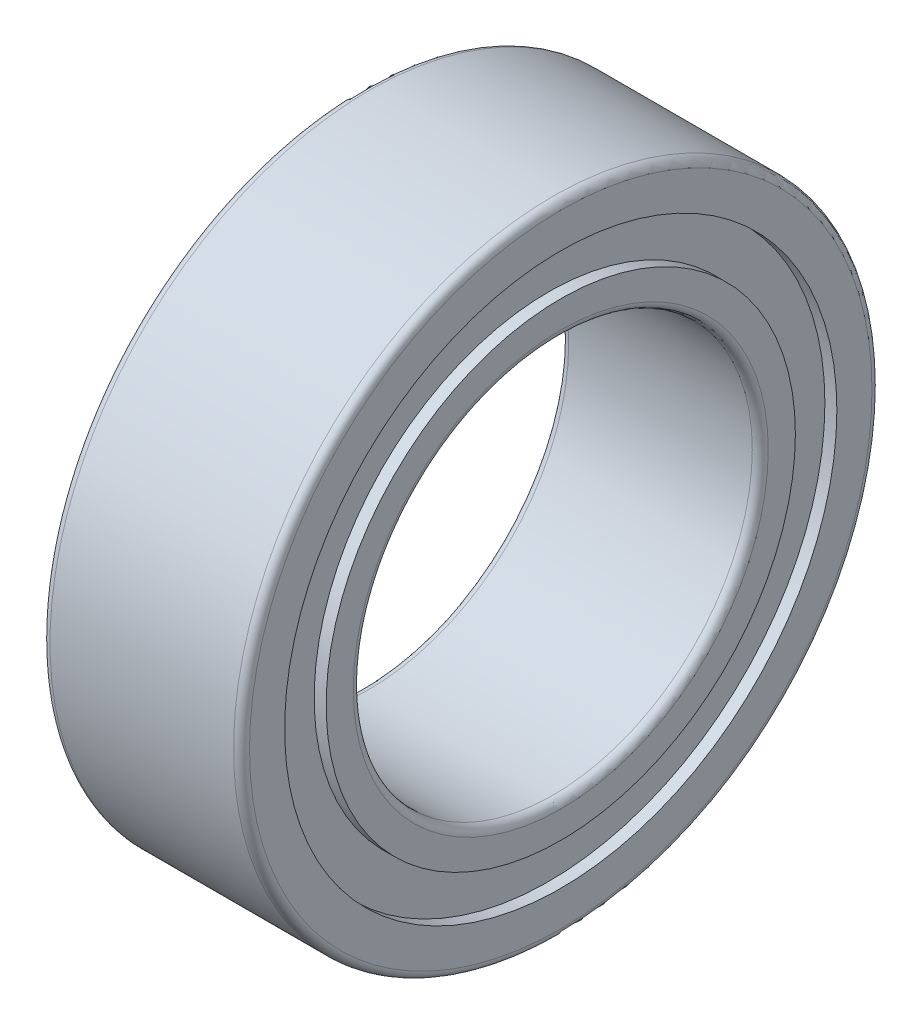
ISO-10303-21;
HEADER;
FILE_DESCRIPTION(('STEP AP214'),'2;1');
FILE_NAME('part.step','',(''),(''),'','','');
FILE_SCHEMA(('AUTOMOTIVE_DESIGN { 1 0 10303 214 1 1 1 1 }'));
ENDSEC;
DATA;
#1=APPLICATION_CONTEXT('core data for automotive mechanical design processes');
#2=APPLICATION_PROTOCOL_DEFINITION('international standard','automotive_design',2000,#1);
#3=PRODUCT_CONTEXT('',#1,'mechanical');
#4=PRODUCT('Part','Part','',(#3));
#5=PRODUCT_RELATED_PRODUCT_CATEGORY('part','',(#4));
#6=PRODUCT_DEFINITION_FORMATION('','',#4);
#7=PRODUCT_DEFINITION_CONTEXT('part definition',#1,'design');
#8=PRODUCT_DEFINITION('design','',#6,#7);
#9=PRODUCT_DEFINITION_SHAPE('','',#8);
#10=(LENGTH_UNIT() NAMED_UNIT(*) SI_UNIT(.MILLI.,.METRE.));
#11=(NAMED_UNIT(*) PLANE_ANGLE_UNIT() SI_UNIT($,.RADIAN.));
#12=(NAMED_UNIT(*) SI_UNIT($,.STERADIAN.) SOLID_ANGLE_UNIT());
#13=UNCERTAINTY_MEASURE_WITH_UNIT(LENGTH_MEASURE(1.E-05),#10,'distance_accuracy_value','');
#14=(GEOMETRIC_REPRESENTATION_CONTEXT(3) GLOBAL_UNCERTAINTY_ASSIGNED_CONTEXT((#13)) GLOBAL_UNIT_ASSIGNED_CONTEXT((#10,
#11,#12)) REPRESENTATION_CONTEXT('',''));
#15=CARTESIAN_POINT('',(0.,0.,0.));
#16=DIRECTION('',(0.,0.,1.));
#17=DIRECTION('',(1.,0.,0.));
#18=AXIS2_PLACEMENT_3D('',#15,#16,#17);
#19=CARTESIAN_POINT('',(-1.15,0.,0.));
#20=DIRECTION('',(1.,0.,0.));
#21=DIRECTION('',(0.,0.,-1.));
#22=AXIS2_PLACEMENT_3D('',#19,#20,#21);
#23=TOROIDAL_SURFACE('',#22,3.9,0.1);
#24=CARTESIAN_POINT('',(-1.25,0.,0.));
#25=DIRECTION('',(1.,0.,0.));
#26=DIRECTION('',(0.,0.,-1.));
#27=AXIS2_PLACEMENT_3D('',#24,#25,#26);
#28=CIRCLE('',#27,3.9);
#29=CARTESIAN_POINT('',(-1.25,0.,-3.9));
#30=VERTEX_POINT('',#29);
#31=EDGE_CURVE('E10',#30,#30,#28,.T.);
#32=ORIENTED_EDGE('',*,*,#31,.T.);
#33=EDGE_LOOP('',(#32));
#34=FACE_BOUND('',#33,.T.);
#35=CARTESIAN_POINT('',(-1.15,0.,0.));
#36=DIRECTION('',(1.,0.,0.));
#37=DIRECTION('',(0.,0.,-1.));
#38=AXIS2_PLACEMENT_3D('',#35,#36,#37);
#39=CIRCLE('',#38,4.);
#40=CARTESIAN_POINT('',(-1.15,0.,-4.));
#41=VERTEX_POINT('',#40);
#42=EDGE_CURVE('E102',#41,#41,#39,.T.);
#43=ORIENTED_EDGE('',*,*,#42,.F.);
#44=EDGE_LOOP('',(#43));
#45=FACE_BOUND('',#44,.T.);
#46=ADVANCED_FACE('F16',(#34,#45),#23,.T.);
#47=CARTESIAN_POINT('',(-1.25,3.46,0.));
#48=DIRECTION('',(1.,0.,0.));
#49=DIRECTION('',(0.,1.,0.));
#50=AXIS2_PLACEMENT_3D('',#47,#48,#49);
#51=PLANE('',#50);
#52=CARTESIAN_POINT('',(-1.25,0.,0.));
#53=DIRECTION('',(1.,0.,0.));
#54=DIRECTION('',(0.,0.,-1.));
#55=AXIS2_PLACEMENT_3D('',#52,#53,#54);
#56=CIRCLE('',#55,3.46);
#57=CARTESIAN_POINT('',(-1.25,0.,-3.46));
#58=VERTEX_POINT('',#57);
#59=EDGE_CURVE('E27',#58,#58,#56,.T.);
#60=ORIENTED_EDGE('',*,*,#59,.T.);
#61=EDGE_LOOP('',(#60));
#62=FACE_BOUND('',#61,.T.);
#63=ORIENTED_EDGE('',*,*,#31,.F.);
#64=EDGE_LOOP('',(#63));
#65=FACE_BOUND('',#64,.T.);
#66=ADVANCED_FACE('F18',(#62,#65),#51,.F.);
#67=CARTESIAN_POINT('',(1.25,0.,0.));
#68=DIRECTION('',(-1.,0.,0.));
#69=DIRECTION('',(0.,0.,-1.));
#70=AXIS2_PLACEMENT_3D('',#67,#68,#69);
#71=CYLINDRICAL_SURFACE('',#70,3.46);
#72=ORIENTED_EDGE('',*,*,#59,.F.);
#73=EDGE_LOOP('',(#72));
#74=FACE_BOUND('',#73,.T.);
#75=CARTESIAN_POINT('',(-1.1,0.,0.));
#76=DIRECTION('',(1.,0.,0.));
#77=DIRECTION('',(0.,0.,-1.));
#78=AXIS2_PLACEMENT_3D('',#75,#76,#77);
#79=CIRCLE('',#78,3.46);
#80=CARTESIAN_POINT('',(-1.1,0.,-3.46));
#81=VERTEX_POINT('',#80);
#82=EDGE_CURVE('E20',#81,#81,#79,.T.);
#83=ORIENTED_EDGE('',*,*,#82,.T.);
#84=EDGE_LOOP('',(#83));
#85=FACE_BOUND('',#84,.T.);
#86=ADVANCED_FACE('F80',(#74,#85),#71,.F.);
#87=CARTESIAN_POINT('',(-1.1,2.94,0.));
#88=DIRECTION('',(1.,0.,0.));
#89=DIRECTION('',(0.,1.,0.));
#90=AXIS2_PLACEMENT_3D('',#87,#88,#89);
#91=PLANE('',#90);
#92=CARTESIAN_POINT('',(-1.1,0.,0.));
#93=DIRECTION('',(1.,0.,0.));
#94=DIRECTION('',(0.,0.,-1.));
#95=AXIS2_PLACEMENT_3D('',#92,#93,#94);
#96=CIRCLE('',#95,2.94);
#97=CARTESIAN_POINT('',(-1.1,0.,-2.94));
#98=VERTEX_POINT('',#97);
#99=EDGE_CURVE('E93',#98,#98,#96,.T.);
#100=ORIENTED_EDGE('',*,*,#99,.T.);
#101=EDGE_LOOP('',(#100));
#102=FACE_BOUND('',#101,.T.);
#103=ORIENTED_EDGE('',*,*,#82,.F.);
#104=EDGE_LOOP('',(#103));
#105=FACE_BOUND('',#104,.T.);
#106=ADVANCED_FACE('F194',(#102,#105),#91,.F.);
#107=CARTESIAN_POINT('',(1.15,0.,0.));
#108=DIRECTION('',(1.,0.,0.));
#109=DIRECTION('',(0.,0.,-1.));
#110=AXIS2_PLACEMENT_3D('',#107,#108,#109);
#111=TOROIDAL_SURFACE('',#110,2.6,0.1);
#112=CARTESIAN_POINT('',(1.25,0.,0.));
#113=DIRECTION('',(1.,0.,0.));
#114=DIRECTION('',(0.,0.,-1.));
#115=AXIS2_PLACEMENT_3D('',#112,#113,#114);
#116=CIRCLE('',#115,2.6);
#117=CARTESIAN_POINT('',(1.25,0.,-2.6));
#118=VERTEX_POINT('',#117);
#119=EDGE_CURVE('E116',#118,#118,#116,.T.);
#120=ORIENTED_EDGE('',*,*,#119,.T.);
#121=EDGE_LOOP('',(#120));
#122=FACE_BOUND('',#121,.T.);
#123=CARTESIAN_POINT('',(1.15,0.,0.));
#124=DIRECTION('',(1.,0.,0.));
#125=DIRECTION('',(0.,0.,-1.));
#126=AXIS2_PLACEMENT_3D('',#123,#124,#125);
#127=CIRCLE('',#126,2.5);
#128=CARTESIAN_POINT('',(1.15,0.,-2.5));
#129=VERTEX_POINT('',#128);
#130=EDGE_CURVE('E74',#129,#129,#127,.T.);
#131=ORIENTED_EDGE('',*,*,#130,.F.);
#132=EDGE_LOOP('',(#131));
#133=FACE_BOUND('',#132,.T.);
#134=ADVANCED_FACE('F197',(#122,#133),#111,.T.);
#135=CARTESIAN_POINT('',(50.,0.,0.));
#136=DIRECTION('',(-1.,0.,0.));
#137=DIRECTION('',(0.,0.,-1.));
#138=AXIS2_PLACEMENT_3D('',#135,#136,#137);
#139=CYLINDRICAL_SURFACE('',#138,2.5);
#140=ORIENTED_EDGE('',*,*,#130,.T.);
#141=EDGE_LOOP('',(#140));
#142=FACE_BOUND('',#141,.T.);
#143=CARTESIAN_POINT('',(-1.15,0.,0.));
#144=DIRECTION('',(1.,0.,0.));
#145=DIRECTION('',(0.,0.,-1.));
#146=AXIS2_PLACEMENT_3D('',#143,#144,#145);
#147=CIRCLE('',#146,2.5);
#148=CARTESIAN_POINT('',(-1.15,0.,-2.5));
#149=VERTEX_POINT('',#148);
#150=EDGE_CURVE('E89',#149,#149,#147,.T.);
#151=ORIENTED_EDGE('',*,*,#150,.F.);
#152=EDGE_LOOP('',(#151));
#153=FACE_BOUND('',#152,.T.);
#154=ADVANCED_FACE('F200',(#142,#153),#139,.F.);
#155=CARTESIAN_POINT('',(-1.15,0.,0.));
#156=DIRECTION('',(1.,0.,0.));
#157=DIRECTION('',(0.,0.,-1.));
#158=AXIS2_PLACEMENT_3D('',#155,#156,#157);
#159=TOROIDAL_SURFACE('',#158,2.6,0.1);
#160=ORIENTED_EDGE('',*,*,#150,.T.);
#161=EDGE_LOOP('',(#160));
#162=FACE_BOUND('',#161,.T.);
#163=CARTESIAN_POINT('',(-1.25,0.,0.));
#164=DIRECTION('',(1.,0.,0.));
#165=DIRECTION('',(0.,0.,-1.));
#166=AXIS2_PLACEMENT_3D('',#163,#164,#165);
#167=CIRCLE('',#166,2.6);
#168=CARTESIAN_POINT('',(-1.25,0.,-2.6));
#169=VERTEX_POINT('',#168);
#170=EDGE_CURVE('E95',#169,#169,#167,.T.);
#171=ORIENTED_EDGE('',*,*,#170,.F.);
#172=EDGE_LOOP('',(#171));
#173=FACE_BOUND('',#172,.T.);
#174=ADVANCED_FACE('F230',(#162,#173),#159,.T.);
#175=CARTESIAN_POINT('',(1.25,0.,0.));
#176=DIRECTION('',(-1.,0.,0.));
#177=DIRECTION('',(0.,0.,-1.));
#178=AXIS2_PLACEMENT_3D('',#175,#176,#177);
#179=CYLINDRICAL_SURFACE('',#178,2.94);
#180=ORIENTED_EDGE('',*,*,#99,.F.);
#181=EDGE_LOOP('',(#180));
#182=FACE_BOUND('',#181,.T.);
#183=CARTESIAN_POINT('',(-1.25,0.,0.));
#184=DIRECTION('',(1.,0.,0.));
#185=DIRECTION('',(0.,0.,-1.));
#186=AXIS2_PLACEMENT_3D('',#183,#184,#185);
#187=CIRCLE('',#186,2.94);
#188=CARTESIAN_POINT('',(-1.25,0.,-2.94));
#189=VERTEX_POINT('',#188);
#190=EDGE_CURVE('E99',#189,#189,#187,.T.);
#191=ORIENTED_EDGE('',*,*,#190,.T.);
#192=EDGE_LOOP('',(#191));
#193=FACE_BOUND('',#192,.T.);
#194=ADVANCED_FACE('F193',(#182,#193),#179,.T.);
#195=CARTESIAN_POINT('',(-1.25,0.,0.));
#196=DIRECTION('',(1.,0.,0.));
#197=DIRECTION('',(0.,1.,0.));
#198=AXIS2_PLACEMENT_3D('',#195,#196,#197);
#199=PLANE('',#198);
#200=ORIENTED_EDGE('',*,*,#170,.T.);
#201=EDGE_LOOP('',(#200));
#202=FACE_BOUND('',#201,.T.);
#203=ORIENTED_EDGE('',*,*,#190,.F.);
#204=EDGE_LOOP('',(#203));
#205=FACE_BOUND('',#204,.T.);
#206=ADVANCED_FACE('F181',(#202,#205),#199,.F.);
#207=CARTESIAN_POINT('',(1.25,0.,0.));
#208=DIRECTION('',(-1.,0.,0.));
#209=DIRECTION('',(0.,0.,-1.));
#210=AXIS2_PLACEMENT_3D('',#207,#208,#209);
#211=CYLINDRICAL_SURFACE('',#210,4.);
#212=CARTESIAN_POINT('',(1.15,0.,0.));
#213=DIRECTION('',(1.,0.,0.));
#214=DIRECTION('',(0.,0.,-1.));
#215=AXIS2_PLACEMENT_3D('',#212,#213,#214);
#216=CIRCLE('',#215,4.);
#217=CARTESIAN_POINT('',(1.15,0.,-4.));
#218=VERTEX_POINT('',#217);
#219=EDGE_CURVE('E105',#218,#218,#216,.T.);
#220=ORIENTED_EDGE('',*,*,#219,.F.);
#221=EDGE_LOOP('',(#220));
#222=FACE_BOUND('',#221,.T.);
#223=ORIENTED_EDGE('',*,*,#42,.T.);
#224=EDGE_LOOP('',(#223));
#225=FACE_BOUND('',#224,.T.);
#226=ADVANCED_FACE('F174',(#222,#225),#211,.T.);
#227=CARTESIAN_POINT('',(1.15,0.,0.));
#228=DIRECTION('',(1.,0.,0.));
#229=DIRECTION('',(0.,0.,-1.));
#230=AXIS2_PLACEMENT_3D('',#227,#228,#229);
#231=TOROIDAL_SURFACE('',#230,3.9,0.1);
#232=ORIENTED_EDGE('',*,*,#219,.T.);
#233=EDGE_LOOP('',(#232));
#234=FACE_BOUND('',#233,.T.);
#235=CARTESIAN_POINT('',(1.25,0.,0.));
#236=DIRECTION('',(1.,0.,0.));
#237=DIRECTION('',(0.,0.,-1.));
#238=AXIS2_PLACEMENT_3D('',#235,#236,#237);
#239=CIRCLE('',#238,3.9);
#240=CARTESIAN_POINT('',(1.25,0.,-3.9));
#241=VERTEX_POINT('',#240);
#242=EDGE_CURVE('E109',#241,#241,#239,.T.);
#243=ORIENTED_EDGE('',*,*,#242,.F.);
#244=EDGE_LOOP('',(#243));
#245=FACE_BOUND('',#244,.T.);
#246=ADVANCED_FACE('F169',(#234,#245),#231,.T.);
#247=CARTESIAN_POINT('',(1.25,3.9,0.));
#248=DIRECTION('',(-1.,0.,0.));
#249=DIRECTION('',(0.,0.,1.));
#250=AXIS2_PLACEMENT_3D('',#247,#248,#249);
#251=PLANE('',#250);
#252=CARTESIAN_POINT('',(1.25,0.,0.));
#253=DIRECTION('',(1.,0.,0.));
#254=DIRECTION('',(0.,0.,-1.));
#255=AXIS2_PLACEMENT_3D('',#252,#253,#254);
#256=CIRCLE('',#255,3.46);
#257=CARTESIAN_POINT('',(1.25,0.,-3.46));
#258=VERTEX_POINT('',#257);
#259=EDGE_CURVE('E106',#258,#258,#256,.T.);
#260=ORIENTED_EDGE('',*,*,#259,.F.);
#261=EDGE_LOOP('',(#260));
#262=FACE_BOUND('',#261,.T.);
#263=ORIENTED_EDGE('',*,*,#242,.T.);
#264=EDGE_LOOP('',(#263));
#265=FACE_BOUND('',#264,.T.);
#266=ADVANCED_FACE('F162',(#262,#265),#251,.F.);
#267=CARTESIAN_POINT('',(1.25,0.,0.));
#268=DIRECTION('',(-1.,0.,0.));
#269=DIRECTION('',(0.,0.,-1.));
#270=AXIS2_PLACEMENT_3D('',#267,#268,#269);
#271=CYLINDRICAL_SURFACE('',#270,3.46);
#272=CARTESIAN_POINT('',(1.1,0.,0.));
#273=DIRECTION('',(1.,0.,0.));
#274=DIRECTION('',(0.,0.,-1.));
#275=AXIS2_PLACEMENT_3D('',#272,#273,#274);
#276=CIRCLE('',#275,3.46);
#277=CARTESIAN_POINT('',(1.1,0.,-3.46));
#278=VERTEX_POINT('',#277);
#279=EDGE_CURVE('E110',#278,#278,#276,.T.);
#280=ORIENTED_EDGE('',*,*,#279,.F.);
#281=EDGE_LOOP('',(#280));
#282=FACE_BOUND('',#281,.T.);
#283=ORIENTED_EDGE('',*,*,#259,.T.);
#284=EDGE_LOOP('',(#283));
#285=FACE_BOUND('',#284,.T.);
#286=ADVANCED_FACE('F153',(#282,#285),#271,.F.);
#287=CARTESIAN_POINT('',(1.1,3.46,0.));
#288=DIRECTION('',(-1.,0.,0.));
#289=DIRECTION('',(0.,0.,1.));
#290=AXIS2_PLACEMENT_3D('',#287,#288,#289);
#291=PLANE('',#290);
#292=CARTESIAN_POINT('',(1.1,0.,0.));
#293=DIRECTION('',(1.,0.,0.));
#294=DIRECTION('',(0.,0.,-1.));
#295=AXIS2_PLACEMENT_3D('',#292,#293,#294);
#296=CIRCLE('',#295,2.94);
#297=CARTESIAN_POINT('',(1.1,0.,-2.94));
#298=VERTEX_POINT('',#297);
#299=EDGE_CURVE('E112',#298,#298,#296,.T.);
#300=ORIENTED_EDGE('',*,*,#299,.F.);
#301=EDGE_LOOP('',(#300));
#302=FACE_BOUND('',#301,.T.);
#303=ORIENTED_EDGE('',*,*,#279,.T.);
#304=EDGE_LOOP('',(#303));
#305=FACE_BOUND('',#304,.T.);
#306=ADVANCED_FACE('F143',(#302,#305),#291,.F.);
#307=CARTESIAN_POINT('',(1.25,0.,0.));
#308=DIRECTION('',(-1.,0.,0.));
#309=DIRECTION('',(0.,0.,-1.));
#310=AXIS2_PLACEMENT_3D('',#307,#308,#309);
#311=CYLINDRICAL_SURFACE('',#310,2.94);
#312=CARTESIAN_POINT('',(1.25,0.,0.));
#313=DIRECTION('',(1.,0.,0.));
#314=DIRECTION('',(0.,0.,-1.));
#315=AXIS2_PLACEMENT_3D('',#312,#313,#314);
#316=CIRCLE('',#315,2.94);
#317=CARTESIAN_POINT('',(1.25,0.,-2.94));
#318=VERTEX_POINT('',#317);
#319=EDGE_CURVE('E125',#318,#318,#316,.T.);
#320=ORIENTED_EDGE('',*,*,#319,.F.);
#321=EDGE_LOOP('',(#320));
#322=FACE_BOUND('',#321,.T.);
#323=ORIENTED_EDGE('',*,*,#299,.T.);
#324=EDGE_LOOP('',(#323));
#325=FACE_BOUND('',#324,.T.);
#326=ADVANCED_FACE('F140',(#322,#325),#311,.T.);
#327=CARTESIAN_POINT('',(1.25,2.94,0.));
#328=DIRECTION('',(-1.,0.,0.));
#329=DIRECTION('',(0.,0.,1.));
#330=AXIS2_PLACEMENT_3D('',#327,#328,#329);
#331=PLANE('',#330);
#332=ORIENTED_EDGE('',*,*,#119,.F.);
#333=EDGE_LOOP('',(#332));
#334=FACE_BOUND('',#333,.T.);
#335=ORIENTED_EDGE('',*,*,#319,.T.);
#336=EDGE_LOOP('',(#335));
#337=FACE_BOUND('',#336,.T.);
#338=ADVANCED_FACE('F135',(#334,#337),#331,.F.);
#339=CLOSED_SHELL('',(#46,#66,#86,#106,#134,#154,#174,#194,#206,#226,#246,#266,#286,#306,#326,#338));
#340=MANIFOLD_SOLID_BREP('B1',#339);
#341=ADVANCED_BREP_SHAPE_REPRESENTATION('',(#18,#340),#14);
#342=SHAPE_DEFINITION_REPRESENTATION(#9,#341);
ENDSEC;
END-ISO-10303-21;
